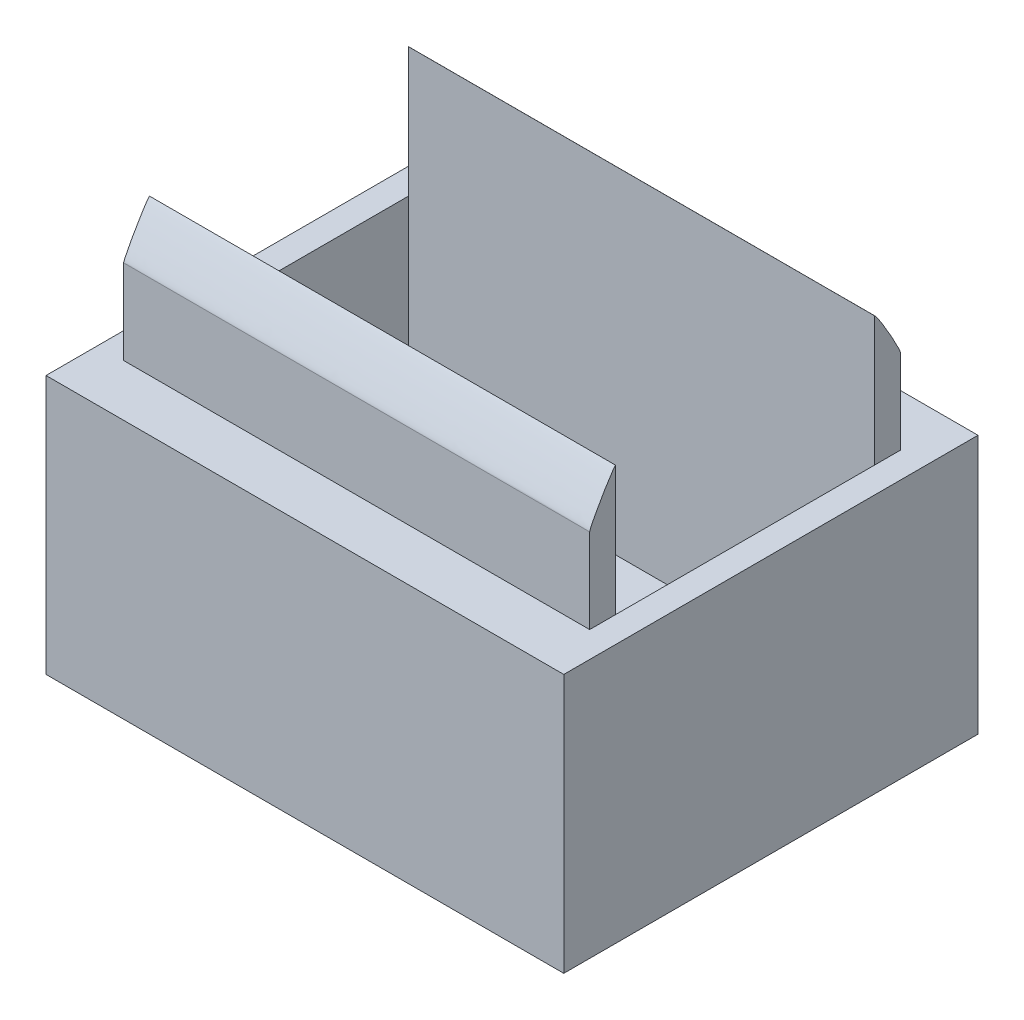
ISO-10303-21;
HEADER;
FILE_DESCRIPTION(('STEP AP214'),'2;1');
FILE_NAME('part.step','',(''),(''),'','','');
FILE_SCHEMA(('AUTOMOTIVE_DESIGN { 1 0 10303 214 1 1 1 1 }'));
ENDSEC;
DATA;
#1=APPLICATION_CONTEXT('core data for automotive mechanical design processes');
#2=APPLICATION_PROTOCOL_DEFINITION('international standard','automotive_design',2000,#1);
#3=PRODUCT_CONTEXT('',#1,'mechanical');
#4=PRODUCT('Part','Part','',(#3));
#5=PRODUCT_RELATED_PRODUCT_CATEGORY('part','',(#4));
#6=PRODUCT_DEFINITION_FORMATION('','',#4);
#7=PRODUCT_DEFINITION_CONTEXT('part definition',#1,'design');
#8=PRODUCT_DEFINITION('design','',#6,#7);
#9=PRODUCT_DEFINITION_SHAPE('','',#8);
#10=(LENGTH_UNIT() NAMED_UNIT(*) SI_UNIT(.MILLI.,.METRE.));
#11=(NAMED_UNIT(*) PLANE_ANGLE_UNIT() SI_UNIT($,.RADIAN.));
#12=(NAMED_UNIT(*) SI_UNIT($,.STERADIAN.) SOLID_ANGLE_UNIT());
#13=UNCERTAINTY_MEASURE_WITH_UNIT(LENGTH_MEASURE(1.E-05),#10,'distance_accuracy_value','');
#14=(GEOMETRIC_REPRESENTATION_CONTEXT(3) GLOBAL_UNCERTAINTY_ASSIGNED_CONTEXT((#13)) GLOBAL_UNIT_ASSIGNED_CONTEXT((#10,
#11,#12)) REPRESENTATION_CONTEXT('',''));
#15=CARTESIAN_POINT('',(0.,0.,0.));
#16=DIRECTION('',(0.,0.,1.));
#17=DIRECTION('',(1.,0.,0.));
#18=AXIS2_PLACEMENT_3D('',#15,#16,#17);
#19=CARTESIAN_POINT('',(0.,10.,0.));
#20=DIRECTION('',(0.,-1.,0.));
#21=DIRECTION('',(0.,0.,-1.));
#22=AXIS2_PLACEMENT_3D('',#19,#20,#21);
#23=PLANE('',#22);
#24=DIRECTION('',(0.,0.,-1.));
#25=VECTOR('',#24,1.);
#26=CARTESIAN_POINT('',(10.,10.,8.));
#27=LINE('',#26,#25);
#28=CARTESIAN_POINT('',(10.,10.,8.));
#29=VERTEX_POINT('',#28);
#30=CARTESIAN_POINT('',(10.,10.,-8.));
#31=VERTEX_POINT('',#30);
#32=EDGE_CURVE('E293',#29,#31,#27,.T.);
#33=ORIENTED_EDGE('',*,*,#32,.T.);
#34=DIRECTION('',(-1.,0.,0.));
#35=VECTOR('',#34,1.);
#36=CARTESIAN_POINT('',(-10.,10.,-8.));
#37=LINE('',#36,#35);
#38=CARTESIAN_POINT('',(-10.,10.,-8.));
#39=VERTEX_POINT('',#38);
#40=EDGE_CURVE('E297',#31,#39,#37,.T.);
#41=ORIENTED_EDGE('',*,*,#40,.T.);
#42=DIRECTION('',(0.,0.,1.));
#43=VECTOR('',#42,1.);
#44=CARTESIAN_POINT('',(-10.,10.,8.));
#45=LINE('',#44,#43);
#46=CARTESIAN_POINT('',(-10.,10.,8.));
#47=VERTEX_POINT('',#46);
#48=EDGE_CURVE('E305',#39,#47,#45,.T.);
#49=ORIENTED_EDGE('',*,*,#48,.T.);
#50=DIRECTION('',(1.,0.,0.));
#51=VECTOR('',#50,1.);
#52=CARTESIAN_POINT('',(-10.,10.,8.));
#53=LINE('',#52,#51);
#54=EDGE_CURVE('E308',#47,#29,#53,.T.);
#55=ORIENTED_EDGE('',*,*,#54,.T.);
#56=EDGE_LOOP('',(#33,#41,#49,#55));
#57=FACE_BOUND('',#56,.T.);
#58=DIRECTION('',(0.,0.,1.));
#59=VECTOR('',#58,1.);
#60=CARTESIAN_POINT('',(-9.,10.,-5.));
#61=LINE('',#60,#59);
#62=CARTESIAN_POINT('',(-9.,10.,-6.));
#63=VERTEX_POINT('',#62);
#64=CARTESIAN_POINT('',(-9.,10.,-5.));
#65=VERTEX_POINT('',#64);
#66=EDGE_CURVE('E167',#63,#65,#61,.T.);
#67=ORIENTED_EDGE('',*,*,#66,.F.);
#68=DIRECTION('',(-1.,0.,0.));
#69=VECTOR('',#68,1.);
#70=CARTESIAN_POINT('',(-9.,10.,-6.));
#71=LINE('',#70,#69);
#72=CARTESIAN_POINT('',(9.,10.,-6.));
#73=VERTEX_POINT('',#72);
#74=EDGE_CURVE('E163',#73,#63,#71,.T.);
#75=ORIENTED_EDGE('',*,*,#74,.F.);
#76=DIRECTION('',(0.,0.,-1.));
#77=VECTOR('',#76,1.);
#78=CARTESIAN_POINT('',(9.,10.,-5.));
#79=LINE('',#78,#77);
#80=CARTESIAN_POINT('',(9.,10.,-5.));
#81=VERTEX_POINT('',#80);
#82=EDGE_CURVE('E271',#81,#73,#79,.T.);
#83=ORIENTED_EDGE('',*,*,#82,.F.);
#84=DIRECTION('',(0.,0.,-1.));
#85=VECTOR('',#84,1.);
#86=CARTESIAN_POINT('',(9.,10.,5.));
#87=LINE('',#86,#85);
#88=CARTESIAN_POINT('',(9.,10.,5.));
#89=VERTEX_POINT('',#88);
#90=EDGE_CURVE('E282',#89,#81,#87,.T.);
#91=ORIENTED_EDGE('',*,*,#90,.F.);
#92=DIRECTION('',(0.,0.,-1.));
#93=VECTOR('',#92,1.);
#94=CARTESIAN_POINT('',(9.,10.,5.));
#95=LINE('',#94,#93);
#96=CARTESIAN_POINT('',(9.,10.,6.));
#97=VERTEX_POINT('',#96);
#98=EDGE_CURVE('E191',#97,#89,#95,.T.);
#99=ORIENTED_EDGE('',*,*,#98,.F.);
#100=DIRECTION('',(1.,0.,0.));
#101=VECTOR('',#100,1.);
#102=CARTESIAN_POINT('',(-9.,10.,6.));
#103=LINE('',#102,#101);
#104=CARTESIAN_POINT('',(-9.,10.,6.));
#105=VERTEX_POINT('',#104);
#106=EDGE_CURVE('E171',#105,#97,#103,.T.);
#107=ORIENTED_EDGE('',*,*,#106,.F.);
#108=DIRECTION('',(0.,0.,1.));
#109=VECTOR('',#108,1.);
#110=CARTESIAN_POINT('',(-9.,10.,5.));
#111=LINE('',#110,#109);
#112=CARTESIAN_POINT('',(-9.,10.,5.));
#113=VERTEX_POINT('',#112);
#114=EDGE_CURVE('E168',#113,#105,#111,.T.);
#115=ORIENTED_EDGE('',*,*,#114,.F.);
#116=DIRECTION('',(0.,0.,1.));
#117=VECTOR('',#116,1.);
#118=CARTESIAN_POINT('',(-9.,10.,5.));
#119=LINE('',#118,#117);
#120=EDGE_CURVE('E274',#65,#113,#119,.T.);
#121=ORIENTED_EDGE('',*,*,#120,.F.);
#122=EDGE_LOOP('',(#67,#75,#83,#91,#99,#107,#115,#121));
#123=FACE_BOUND('',#122,.T.);
#124=ADVANCED_FACE('F38',(#57,#123),#23,.F.);
#125=CARTESIAN_POINT('',(10.,2.,8.));
#126=DIRECTION('',(-1.,0.,0.));
#127=DIRECTION('',(0.,0.,1.));
#128=AXIS2_PLACEMENT_3D('',#125,#126,#127);
#129=PLANE('',#128);
#130=DIRECTION('',(0.,0.,-1.));
#131=VECTOR('',#130,1.);
#132=CARTESIAN_POINT('',(10.,0.,8.));
#133=LINE('',#132,#131);
#134=CARTESIAN_POINT('',(10.,0.,8.));
#135=VERTEX_POINT('',#134);
#136=CARTESIAN_POINT('',(10.,0.,-8.));
#137=VERTEX_POINT('',#136);
#138=EDGE_CURVE('E311',#135,#137,#133,.T.);
#139=ORIENTED_EDGE('',*,*,#138,.T.);
#140=DIRECTION('',(0.,-1.,0.));
#141=VECTOR('',#140,1.);
#142=CARTESIAN_POINT('',(10.,2.,-8.));
#143=LINE('',#142,#141);
#144=EDGE_CURVE('E205',#31,#137,#143,.T.);
#145=ORIENTED_EDGE('',*,*,#144,.F.);
#146=ORIENTED_EDGE('',*,*,#32,.F.);
#147=DIRECTION('',(0.,-1.,0.));
#148=VECTOR('',#147,1.);
#149=CARTESIAN_POINT('',(10.,2.,8.));
#150=LINE('',#149,#148);
#151=EDGE_CURVE('E320',#29,#135,#150,.T.);
#152=ORIENTED_EDGE('',*,*,#151,.T.);
#153=EDGE_LOOP('',(#139,#145,#146,#152));
#154=FACE_BOUND('',#153,.T.);
#155=ADVANCED_FACE('F364',(#154),#129,.F.);
#156=CARTESIAN_POINT('',(-10.,2.,-8.));
#157=DIRECTION('',(0.,0.,1.));
#158=DIRECTION('',(1.,0.,0.));
#159=AXIS2_PLACEMENT_3D('',#156,#157,#158);
#160=PLANE('',#159);
#161=DIRECTION('',(-1.,0.,0.));
#162=VECTOR('',#161,1.);
#163=CARTESIAN_POINT('',(-10.,0.,-8.));
#164=LINE('',#163,#162);
#165=CARTESIAN_POINT('',(-10.,0.,-8.));
#166=VERTEX_POINT('',#165);
#167=EDGE_CURVE('E314',#137,#166,#164,.T.);
#168=ORIENTED_EDGE('',*,*,#167,.T.);
#169=DIRECTION('',(0.,-1.,0.));
#170=VECTOR('',#169,1.);
#171=CARTESIAN_POINT('',(-10.,2.,-8.));
#172=LINE('',#171,#170);
#173=EDGE_CURVE('E325',#39,#166,#172,.T.);
#174=ORIENTED_EDGE('',*,*,#173,.F.);
#175=ORIENTED_EDGE('',*,*,#40,.F.);
#176=ORIENTED_EDGE('',*,*,#144,.T.);
#177=EDGE_LOOP('',(#168,#174,#175,#176));
#178=FACE_BOUND('',#177,.T.);
#179=ADVANCED_FACE('F424',(#178),#160,.F.);
#180=CARTESIAN_POINT('',(-10.,2.,8.));
#181=DIRECTION('',(1.,0.,0.));
#182=DIRECTION('',(0.,0.,-1.));
#183=AXIS2_PLACEMENT_3D('',#180,#181,#182);
#184=PLANE('',#183);
#185=DIRECTION('',(0.,0.,1.));
#186=VECTOR('',#185,1.);
#187=CARTESIAN_POINT('',(-10.,0.,8.));
#188=LINE('',#187,#186);
#189=CARTESIAN_POINT('',(-10.,0.,8.));
#190=VERTEX_POINT('',#189);
#191=EDGE_CURVE('E316',#166,#190,#188,.T.);
#192=ORIENTED_EDGE('',*,*,#191,.T.);
#193=DIRECTION('',(0.,-1.,0.));
#194=VECTOR('',#193,1.);
#195=CARTESIAN_POINT('',(-10.,2.,8.));
#196=LINE('',#195,#194);
#197=EDGE_CURVE('E323',#47,#190,#196,.T.);
#198=ORIENTED_EDGE('',*,*,#197,.F.);
#199=ORIENTED_EDGE('',*,*,#48,.F.);
#200=ORIENTED_EDGE('',*,*,#173,.T.);
#201=EDGE_LOOP('',(#192,#198,#199,#200));
#202=FACE_BOUND('',#201,.T.);
#203=ADVANCED_FACE('F421',(#202),#184,.F.);
#204=CARTESIAN_POINT('',(-10.,2.,8.));
#205=DIRECTION('',(0.,0.,-1.));
#206=DIRECTION('',(-1.,0.,0.));
#207=AXIS2_PLACEMENT_3D('',#204,#205,#206);
#208=PLANE('',#207);
#209=DIRECTION('',(1.,0.,0.));
#210=VECTOR('',#209,1.);
#211=CARTESIAN_POINT('',(-10.,0.,8.));
#212=LINE('',#211,#210);
#213=EDGE_CURVE('E318',#190,#135,#212,.T.);
#214=ORIENTED_EDGE('',*,*,#213,.T.);
#215=ORIENTED_EDGE('',*,*,#151,.F.);
#216=ORIENTED_EDGE('',*,*,#54,.F.);
#217=ORIENTED_EDGE('',*,*,#197,.T.);
#218=EDGE_LOOP('',(#214,#215,#216,#217));
#219=FACE_BOUND('',#218,.T.);
#220=ADVANCED_FACE('F417',(#219),#208,.F.);
#221=CARTESIAN_POINT('',(0.,0.,0.));
#222=DIRECTION('',(0.,-1.,0.));
#223=DIRECTION('',(0.,0.,-1.));
#224=AXIS2_PLACEMENT_3D('',#221,#222,#223);
#225=PLANE('',#224);
#226=ORIENTED_EDGE('',*,*,#138,.F.);
#227=ORIENTED_EDGE('',*,*,#213,.F.);
#228=ORIENTED_EDGE('',*,*,#191,.F.);
#229=ORIENTED_EDGE('',*,*,#167,.F.);
#230=EDGE_LOOP('',(#226,#227,#228,#229));
#231=FACE_BOUND('',#230,.T.);
#232=ADVANCED_FACE('F408',(#231),#225,.T.);
#233=CARTESIAN_POINT('',(9.,10.,5.));
#234=DIRECTION('',(-1.,0.,0.));
#235=DIRECTION('',(0.,0.,1.));
#236=AXIS2_PLACEMENT_3D('',#233,#234,#235);
#237=PLANE('',#236);
#238=DIRECTION('',(0.,0.,-1.));
#239=VECTOR('',#238,1.);
#240=CARTESIAN_POINT('',(9.,2.,5.));
#241=LINE('',#240,#239);
#242=CARTESIAN_POINT('',(9.,2.,5.));
#243=VERTEX_POINT('',#242);
#244=CARTESIAN_POINT('',(9.,2.,-5.));
#245=VERTEX_POINT('',#244);
#246=EDGE_CURVE('E338',#243,#245,#241,.T.);
#247=ORIENTED_EDGE('',*,*,#246,.F.);
#248=DIRECTION('',(0.,-1.,0.));
#249=VECTOR('',#248,1.);
#250=CARTESIAN_POINT('',(9.,10.,5.));
#251=LINE('',#250,#249);
#252=EDGE_CURVE('E289',#89,#243,#251,.T.);
#253=ORIENTED_EDGE('',*,*,#252,.F.);
#254=ORIENTED_EDGE('',*,*,#90,.T.);
#255=DIRECTION('',(0.,-1.,0.));
#256=VECTOR('',#255,1.);
#257=CARTESIAN_POINT('',(9.,10.,-5.));
#258=LINE('',#257,#256);
#259=EDGE_CURVE('E287',#81,#245,#258,.T.);
#260=ORIENTED_EDGE('',*,*,#259,.T.);
#261=EDGE_LOOP('',(#247,#253,#254,#260));
#262=FACE_BOUND('',#261,.T.);
#263=ADVANCED_FACE('F286',(#262),#237,.T.);
#264=CARTESIAN_POINT('',(-9.,10.,-5.));
#265=DIRECTION('',(0.,0.,1.));
#266=DIRECTION('',(1.,0.,0.));
#267=AXIS2_PLACEMENT_3D('',#264,#265,#266);
#268=PLANE('',#267);
#269=DIRECTION('',(-1.,0.,0.));
#270=VECTOR('',#269,1.);
#271=CARTESIAN_POINT('',(-9.,2.,-5.));
#272=LINE('',#271,#270);
#273=CARTESIAN_POINT('',(-9.,2.,-5.));
#274=VERTEX_POINT('',#273);
#275=EDGE_CURVE('E292',#245,#274,#272,.T.);
#276=ORIENTED_EDGE('',*,*,#275,.F.);
#277=ORIENTED_EDGE('',*,*,#259,.F.);
#278=DIRECTION('',(0.,-1.,0.));
#279=VECTOR('',#278,1.);
#280=CARTESIAN_POINT('',(9.,15.,-5.));
#281=LINE('',#280,#279);
#282=CARTESIAN_POINT('',(9.,15.,-5.));
#283=VERTEX_POINT('',#282);
#284=EDGE_CURVE('E161',#283,#81,#281,.T.);
#285=ORIENTED_EDGE('',*,*,#284,.F.);
#286=CARTESIAN_POINT('',(-9.9,14.9999999999999,-4.99999999999996));
#287=CARTESIAN_POINT('',(-3.3,14.9999999999999,-4.99999999999996));
#288=CARTESIAN_POINT('',(3.30000000000001,14.9999999999999,-4.99999999999996));
#289=CARTESIAN_POINT('',(9.9,14.9999999999999,-4.99999999999996));
#290=(BOUNDED_CURVE() B_SPLINE_CURVE(3,(#286,#287,#288,#289),.UNSPECIFIED.,.F.,
.F.) B_SPLINE_CURVE_WITH_KNOTS((4,4),(-0.0099,0.0099),
.UNSPECIFIED.) CURVE() GEOMETRIC_REPRESENTATION_ITEM() RATIONAL_B_SPLINE_CURVE((1.,1.,1.,1.)) REPRESENTATION_ITEM(''));
#291=CARTESIAN_POINT('',(-9.,15.,-5.));
#292=VERTEX_POINT('',#291);
#293=EDGE_CURVE('E148',#292,#283,#290,.T.);
#294=ORIENTED_EDGE('',*,*,#293,.F.);
#295=DIRECTION('',(0.,-1.,0.));
#296=VECTOR('',#295,1.);
#297=CARTESIAN_POINT('',(-9.,15.,-5.));
#298=LINE('',#297,#296);
#299=EDGE_CURVE('E158',#292,#65,#298,.T.);
#300=ORIENTED_EDGE('',*,*,#299,.T.);
#301=DIRECTION('',(0.,-1.,0.));
#302=VECTOR('',#301,1.);
#303=CARTESIAN_POINT('',(-9.,10.,-5.));
#304=LINE('',#303,#302);
#305=EDGE_CURVE('E294',#65,#274,#304,.T.);
#306=ORIENTED_EDGE('',*,*,#305,.T.);
#307=EDGE_LOOP('',(#276,#277,#285,#294,#300,#306));
#308=FACE_BOUND('',#307,.T.);
#309=ADVANCED_FACE('F157',(#308),#268,.T.);
#310=CARTESIAN_POINT('',(-9.,10.,5.));
#311=DIRECTION('',(1.,0.,0.));
#312=DIRECTION('',(0.,0.,-1.));
#313=AXIS2_PLACEMENT_3D('',#310,#311,#312);
#314=PLANE('',#313);
#315=DIRECTION('',(0.,0.,1.));
#316=VECTOR('',#315,1.);
#317=CARTESIAN_POINT('',(-9.,2.,5.));
#318=LINE('',#317,#316);
#319=CARTESIAN_POINT('',(-9.,2.,5.));
#320=VERTEX_POINT('',#319);
#321=EDGE_CURVE('E557',#274,#320,#318,.T.);
#322=ORIENTED_EDGE('',*,*,#321,.F.);
#323=ORIENTED_EDGE('',*,*,#305,.F.);
#324=ORIENTED_EDGE('',*,*,#120,.T.);
#325=DIRECTION('',(0.,-1.,0.));
#326=VECTOR('',#325,1.);
#327=CARTESIAN_POINT('',(-9.,10.,5.));
#328=LINE('',#327,#326);
#329=EDGE_CURVE('E299',#113,#320,#328,.T.);
#330=ORIENTED_EDGE('',*,*,#329,.T.);
#331=EDGE_LOOP('',(#322,#323,#324,#330));
#332=FACE_BOUND('',#331,.T.);
#333=ADVANCED_FACE('F400',(#332),#314,.T.);
#334=CARTESIAN_POINT('',(-9.,10.,5.));
#335=DIRECTION('',(0.,0.,-1.));
#336=DIRECTION('',(-1.,0.,0.));
#337=AXIS2_PLACEMENT_3D('',#334,#335,#336);
#338=PLANE('',#337);
#339=DIRECTION('',(1.,0.,0.));
#340=VECTOR('',#339,1.);
#341=CARTESIAN_POINT('',(-9.,2.,5.));
#342=LINE('',#341,#340);
#343=EDGE_CURVE('E290',#320,#243,#342,.T.);
#344=ORIENTED_EDGE('',*,*,#343,.F.);
#345=ORIENTED_EDGE('',*,*,#329,.F.);
#346=DIRECTION('',(0.,-1.,0.));
#347=VECTOR('',#346,1.);
#348=CARTESIAN_POINT('',(-9.,15.,5.));
#349=LINE('',#348,#347);
#350=CARTESIAN_POINT('',(-9.,15.,5.));
#351=VERTEX_POINT('',#350);
#352=EDGE_CURVE('E256',#351,#113,#349,.T.);
#353=ORIENTED_EDGE('',*,*,#352,.F.);
#354=CARTESIAN_POINT('',(9.9,14.9999999999999,4.99999999999996));
#355=CARTESIAN_POINT('',(3.30000000000001,14.9999999999999,4.99999999999996));
#356=CARTESIAN_POINT('',(-3.3,14.9999999999999,4.99999999999996));
#357=CARTESIAN_POINT('',(-9.9,14.9999999999999,4.99999999999996));
#358=(BOUNDED_CURVE() B_SPLINE_CURVE(3,(#354,#355,#356,#357),.UNSPECIFIED.,.F.,
.F.) B_SPLINE_CURVE_WITH_KNOTS((4,4),(-0.0099,0.0099),
.UNSPECIFIED.) CURVE() GEOMETRIC_REPRESENTATION_ITEM() RATIONAL_B_SPLINE_CURVE((1.,1.,1.,1.)) REPRESENTATION_ITEM(''));
#359=CARTESIAN_POINT('',(9.,15.,5.));
#360=VERTEX_POINT('',#359);
#361=EDGE_CURVE('E194',#360,#351,#358,.T.);
#362=ORIENTED_EDGE('',*,*,#361,.F.);
#363=DIRECTION('',(0.,-1.,0.));
#364=VECTOR('',#363,1.);
#365=CARTESIAN_POINT('',(9.,15.,5.));
#366=LINE('',#365,#364);
#367=EDGE_CURVE('E204',#360,#89,#366,.T.);
#368=ORIENTED_EDGE('',*,*,#367,.T.);
#369=ORIENTED_EDGE('',*,*,#252,.T.);
#370=EDGE_LOOP('',(#344,#345,#353,#362,#368,#369));
#371=FACE_BOUND('',#370,.T.);
#372=ADVANCED_FACE('F390',(#371),#338,.T.);
#373=CARTESIAN_POINT('',(0.,2.,0.));
#374=DIRECTION('',(0.,-1.,0.));
#375=DIRECTION('',(0.,0.,-1.));
#376=AXIS2_PLACEMENT_3D('',#373,#374,#375);
#377=PLANE('',#376);
#378=ORIENTED_EDGE('',*,*,#343,.T.);
#379=ORIENTED_EDGE('',*,*,#246,.T.);
#380=ORIENTED_EDGE('',*,*,#275,.T.);
#381=ORIENTED_EDGE('',*,*,#321,.T.);
#382=EDGE_LOOP('',(#378,#379,#380,#381));
#383=FACE_BOUND('',#382,.T.);
#384=ADVANCED_FACE('F399',(#383),#377,.F.);
#385=CARTESIAN_POINT('',(-9.,15.,5.));
#386=DIRECTION('',(1.,0.,0.));
#387=DIRECTION('',(0.,0.,-1.));
#388=AXIS2_PLACEMENT_3D('',#385,#386,#387);
#389=PLANE('',#388);
#390=DIRECTION('',(0.,-1.,0.));
#391=VECTOR('',#390,1.);
#392=CARTESIAN_POINT('',(-9.,15.,6.));
#393=LINE('',#392,#391);
#394=CARTESIAN_POINT('',(-9.,13.267949192431,6.));
#395=VERTEX_POINT('',#394);
#396=EDGE_CURVE('E203',#395,#105,#393,.T.);
#397=ORIENTED_EDGE('',*,*,#396,.F.);
#398=CARTESIAN_POINT('',(-9.,14.9999999999999,4.99999999999996));
#399=CARTESIAN_POINT('',(-9.,14.4226497308103,6.));
#400=CARTESIAN_POINT('',(-9.,13.267949192431,6.));
#401=(BOUNDED_CURVE() B_SPLINE_CURVE(2,(#398,#399,#400),.UNSPECIFIED.,.F.,
.F.) B_SPLINE_CURVE_WITH_KNOTS((3,3),(0.,1.),
.UNSPECIFIED.) CURVE() GEOMETRIC_REPRESENTATION_ITEM() RATIONAL_B_SPLINE_CURVE((1.,
0.111111111111111,1.)) REPRESENTATION_ITEM(''));
#402=EDGE_CURVE('E151',#395,#351,#401,.F.);
#403=ORIENTED_EDGE('',*,*,#402,.T.);
#404=ORIENTED_EDGE('',*,*,#352,.T.);
#405=ORIENTED_EDGE('',*,*,#114,.T.);
#406=EDGE_LOOP('',(#397,#403,#404,#405));
#407=FACE_BOUND('',#406,.T.);
#408=ADVANCED_FACE('F232',(#407),#389,.F.);
#409=CARTESIAN_POINT('',(-9.,15.,6.));
#410=DIRECTION('',(0.,0.,-1.));
#411=DIRECTION('',(-1.,0.,0.));
#412=AXIS2_PLACEMENT_3D('',#409,#410,#411);
#413=PLANE('',#412);
#414=DIRECTION('',(0.,-1.,0.));
#415=VECTOR('',#414,1.);
#416=CARTESIAN_POINT('',(9.,15.,6.));
#417=LINE('',#416,#415);
#418=CARTESIAN_POINT('',(9.,13.267949192431,6.));
#419=VERTEX_POINT('',#418);
#420=EDGE_CURVE('E200',#419,#97,#417,.T.);
#421=ORIENTED_EDGE('',*,*,#420,.F.);
#422=CARTESIAN_POINT('',(-9.9,13.267949192431,6.));
#423=CARTESIAN_POINT('',(-3.3,13.267949192431,6.));
#424=CARTESIAN_POINT('',(3.3,13.267949192431,6.));
#425=CARTESIAN_POINT('',(9.9,13.267949192431,6.));
#426=(BOUNDED_CURVE() B_SPLINE_CURVE(3,(#422,#423,#424,#425),.UNSPECIFIED.,.F.,
.F.) B_SPLINE_CURVE_WITH_KNOTS((4,4),(-0.0099,0.0099),
.UNSPECIFIED.) CURVE() GEOMETRIC_REPRESENTATION_ITEM() RATIONAL_B_SPLINE_CURVE((1.,1.,1.,1.)) REPRESENTATION_ITEM(''));
#427=EDGE_CURVE('E333',#419,#395,#426,.F.);
#428=ORIENTED_EDGE('',*,*,#427,.T.);
#429=ORIENTED_EDGE('',*,*,#396,.T.);
#430=ORIENTED_EDGE('',*,*,#106,.T.);
#431=EDGE_LOOP('',(#421,#428,#429,#430));
#432=FACE_BOUND('',#431,.T.);
#433=ADVANCED_FACE('F226',(#432),#413,.F.);
#434=CARTESIAN_POINT('',(9.,15.,5.));
#435=DIRECTION('',(-1.,0.,0.));
#436=DIRECTION('',(0.,0.,1.));
#437=AXIS2_PLACEMENT_3D('',#434,#435,#436);
#438=PLANE('',#437);
#439=ORIENTED_EDGE('',*,*,#367,.F.);
#440=CARTESIAN_POINT('',(9.00000000000001,13.267949192431,6.));
#441=CARTESIAN_POINT('',(9.,14.4226497308103,6.));
#442=CARTESIAN_POINT('',(9.,14.9999999999999,4.99999999999996));
#443=(BOUNDED_CURVE() B_SPLINE_CURVE(2,(#440,#441,#442),.UNSPECIFIED.,.F.,
.F.) B_SPLINE_CURVE_WITH_KNOTS((3,3),(0.,1.),
.UNSPECIFIED.) CURVE() GEOMETRIC_REPRESENTATION_ITEM() RATIONAL_B_SPLINE_CURVE((1.,
0.111111111111111,1.)) REPRESENTATION_ITEM(''));
#444=EDGE_CURVE('E210',#360,#419,#443,.F.);
#445=ORIENTED_EDGE('',*,*,#444,.T.);
#446=ORIENTED_EDGE('',*,*,#420,.T.);
#447=ORIENTED_EDGE('',*,*,#98,.T.);
#448=EDGE_LOOP('',(#439,#445,#446,#447));
#449=FACE_BOUND('',#448,.T.);
#450=ADVANCED_FACE('F217',(#449),#438,.F.);
#451=CARTESIAN_POINT('',(-9.,15.,-5.));
#452=DIRECTION('',(1.,0.,0.));
#453=DIRECTION('',(0.,0.,-1.));
#454=AXIS2_PLACEMENT_3D('',#451,#452,#453);
#455=PLANE('',#454);
#456=ORIENTED_EDGE('',*,*,#299,.F.);
#457=CARTESIAN_POINT('',(-9.,13.267949192431,-6.));
#458=CARTESIAN_POINT('',(-9.,14.4226497308103,-6.));
#459=CARTESIAN_POINT('',(-9.,14.9999999999999,-4.99999999999996));
#460=(BOUNDED_CURVE() B_SPLINE_CURVE(2,(#457,#458,#459),.UNSPECIFIED.,.F.,
.F.) B_SPLINE_CURVE_WITH_KNOTS((3,3),(0.,1.),
.UNSPECIFIED.) CURVE() GEOMETRIC_REPRESENTATION_ITEM() RATIONAL_B_SPLINE_CURVE((1.,
0.111111111111111,1.)) REPRESENTATION_ITEM(''));
#461=CARTESIAN_POINT('',(-9.,13.267949192431,-6.));
#462=VERTEX_POINT('',#461);
#463=EDGE_CURVE('E68',#292,#462,#460,.F.);
#464=ORIENTED_EDGE('',*,*,#463,.T.);
#465=DIRECTION('',(0.,-1.,0.));
#466=VECTOR('',#465,1.);
#467=CARTESIAN_POINT('',(-9.,15.,-6.));
#468=LINE('',#467,#466);
#469=EDGE_CURVE('E162',#462,#63,#468,.T.);
#470=ORIENTED_EDGE('',*,*,#469,.T.);
#471=ORIENTED_EDGE('',*,*,#66,.T.);
#472=EDGE_LOOP('',(#456,#464,#470,#471));
#473=FACE_BOUND('',#472,.T.);
#474=ADVANCED_FACE('F165',(#473),#455,.F.);
#475=CARTESIAN_POINT('',(9.,15.,-5.));
#476=DIRECTION('',(-1.,0.,0.));
#477=DIRECTION('',(0.,0.,1.));
#478=AXIS2_PLACEMENT_3D('',#475,#476,#477);
#479=PLANE('',#478);
#480=DIRECTION('',(0.,-1.,0.));
#481=VECTOR('',#480,1.);
#482=CARTESIAN_POINT('',(9.,15.,-6.));
#483=LINE('',#482,#481);
#484=CARTESIAN_POINT('',(9.,13.267949192431,-6.));
#485=VERTEX_POINT('',#484);
#486=EDGE_CURVE('E173',#485,#73,#483,.T.);
#487=ORIENTED_EDGE('',*,*,#486,.F.);
#488=CARTESIAN_POINT('',(9.,14.9999999999999,-4.99999999999996));
#489=CARTESIAN_POINT('',(9.,14.4226497308103,-6.));
#490=CARTESIAN_POINT('',(9.00000000000001,13.267949192431,-6.));
#491=(BOUNDED_CURVE() B_SPLINE_CURVE(2,(#488,#489,#490),.UNSPECIFIED.,.F.,
.F.) B_SPLINE_CURVE_WITH_KNOTS((3,3),(0.,1.),
.UNSPECIFIED.) CURVE() GEOMETRIC_REPRESENTATION_ITEM() RATIONAL_B_SPLINE_CURVE((1.,
0.111111111111111,1.)) REPRESENTATION_ITEM(''));
#492=EDGE_CURVE('E12',#485,#283,#491,.F.);
#493=ORIENTED_EDGE('',*,*,#492,.T.);
#494=ORIENTED_EDGE('',*,*,#284,.T.);
#495=ORIENTED_EDGE('',*,*,#82,.T.);
#496=EDGE_LOOP('',(#487,#493,#494,#495));
#497=FACE_BOUND('',#496,.T.);
#498=ADVANCED_FACE('F278',(#497),#479,.F.);
#499=CARTESIAN_POINT('',(-9.,15.,-6.));
#500=DIRECTION('',(0.,0.,1.));
#501=DIRECTION('',(1.,0.,0.));
#502=AXIS2_PLACEMENT_3D('',#499,#500,#501);
#503=PLANE('',#502);
#504=ORIENTED_EDGE('',*,*,#469,.F.);
#505=CARTESIAN_POINT('',(9.9,13.267949192431,-6.));
#506=CARTESIAN_POINT('',(3.3,13.267949192431,-6.));
#507=CARTESIAN_POINT('',(-3.3,13.267949192431,-6.));
#508=CARTESIAN_POINT('',(-9.9,13.267949192431,-6.));
#509=(BOUNDED_CURVE() B_SPLINE_CURVE(3,(#505,#506,#507,#508),.UNSPECIFIED.,.F.,
.F.) B_SPLINE_CURVE_WITH_KNOTS((4,4),(-0.0099,0.0099),
.UNSPECIFIED.) CURVE() GEOMETRIC_REPRESENTATION_ITEM() RATIONAL_B_SPLINE_CURVE((1.,1.,1.,1.)) REPRESENTATION_ITEM(''));
#510=EDGE_CURVE('E53',#462,#485,#509,.F.);
#511=ORIENTED_EDGE('',*,*,#510,.T.);
#512=ORIENTED_EDGE('',*,*,#486,.T.);
#513=ORIENTED_EDGE('',*,*,#74,.T.);
#514=EDGE_LOOP('',(#504,#511,#512,#513));
#515=FACE_BOUND('',#514,.T.);
#516=ADVANCED_FACE('F267',(#515),#503,.F.);
#517=CARTESIAN_POINT('',(9.9,13.267949192431,6.));
#518=CARTESIAN_POINT('',(3.3,13.267949192431,6.));
#519=CARTESIAN_POINT('',(-3.3,13.267949192431,6.));
#520=CARTESIAN_POINT('',(-9.9,13.267949192431,6.));
#521=CARTESIAN_POINT('',(9.9,14.4226497308103,6.));
#522=CARTESIAN_POINT('',(3.30000000000001,14.4226497308103,6.));
#523=CARTESIAN_POINT('',(-3.3,14.4226497308103,6.));
#524=CARTESIAN_POINT('',(-9.9,14.4226497308103,6.));
#525=CARTESIAN_POINT('',(9.9,14.9999999999999,4.99999999999996));
#526=CARTESIAN_POINT('',(3.30000000000001,14.9999999999999,4.99999999999996));
#527=CARTESIAN_POINT('',(-3.3,14.9999999999999,4.99999999999996));
#528=CARTESIAN_POINT('',(-9.9,14.9999999999999,4.99999999999996));
#529=(BOUNDED_SURFACE() B_SPLINE_SURFACE(2,3,((#517,#518,#519,#520),(#521,#522,#523,#524),(#525,
#526,#527,#528)),.UNSPECIFIED.,.F.,.F.,.F.) B_SPLINE_SURFACE_WITH_KNOTS((3,3),(4,4),(0.,1.),
(-0.0099,0.0099),.UNSPECIFIED.) GEOMETRIC_REPRESENTATION_ITEM() RATIONAL_B_SPLINE_SURFACE(((1.,
1.,1.,1.),(0.111111111111111,0.111111111111111,0.111111111111111,0.111111111111111),(1.,1.,1.,1.))) REPRESENTATION_ITEM('') SURFACE());
#530=ORIENTED_EDGE('',*,*,#402,.F.);
#531=ORIENTED_EDGE('',*,*,#427,.F.);
#532=ORIENTED_EDGE('',*,*,#444,.F.);
#533=ORIENTED_EDGE('',*,*,#361,.T.);
#534=EDGE_LOOP('',(#530,#531,#532,#533));
#535=FACE_BOUND('',#534,.T.);
#536=ADVANCED_FACE('F341',(#535),#529,.T.);
#537=CARTESIAN_POINT('',(9.9,14.9999999999999,-4.99999999999996));
#538=CARTESIAN_POINT('',(3.30000000000001,14.9999999999999,-4.99999999999996));
#539=CARTESIAN_POINT('',(-3.3,14.9999999999999,-4.99999999999996));
#540=CARTESIAN_POINT('',(-9.9,14.9999999999999,-4.99999999999996));
#541=CARTESIAN_POINT('',(9.9,14.4226497308103,-6.));
#542=CARTESIAN_POINT('',(3.30000000000001,14.4226497308103,-6.));
#543=CARTESIAN_POINT('',(-3.3,14.4226497308103,-6.));
#544=CARTESIAN_POINT('',(-9.9,14.4226497308103,-6.));
#545=CARTESIAN_POINT('',(9.9,13.267949192431,-6.));
#546=CARTESIAN_POINT('',(3.3,13.267949192431,-6.));
#547=CARTESIAN_POINT('',(-3.3,13.267949192431,-6.));
#548=CARTESIAN_POINT('',(-9.9,13.267949192431,-6.));
#549=(BOUNDED_SURFACE() B_SPLINE_SURFACE(2,3,((#537,#538,#539,#540),(#541,#542,#543,#544),(#545,
#546,#547,#548)),.UNSPECIFIED.,.F.,.F.,.F.) B_SPLINE_SURFACE_WITH_KNOTS((3,3),(4,4),(0.,1.),
(-0.0099,0.0099),.UNSPECIFIED.) GEOMETRIC_REPRESENTATION_ITEM() RATIONAL_B_SPLINE_SURFACE(((1.,
1.,1.,1.),(0.111111111111111,0.111111111111111,0.111111111111111,0.111111111111111),(1.,1.,1.,1.))) REPRESENTATION_ITEM('') SURFACE());
#550=ORIENTED_EDGE('',*,*,#492,.F.);
#551=ORIENTED_EDGE('',*,*,#510,.F.);
#552=ORIENTED_EDGE('',*,*,#463,.F.);
#553=ORIENTED_EDGE('',*,*,#293,.T.);
#554=EDGE_LOOP('',(#550,#551,#552,#553));
#555=FACE_BOUND('',#554,.T.);
#556=ADVANCED_FACE('F41',(#555),#549,.T.);
#557=CLOSED_SHELL('',(#124,#155,#179,#203,#220,#232,#263,#309,#333,#372,#384,#408,#433,#450,
#474,#498,#516,#536,#556));
#558=MANIFOLD_SOLID_BREP('B2',#557);
#559=ADVANCED_BREP_SHAPE_REPRESENTATION('',(#18,#558),#14);
#560=SHAPE_DEFINITION_REPRESENTATION(#9,#559);
ENDSEC;
END-ISO-10303-21;
